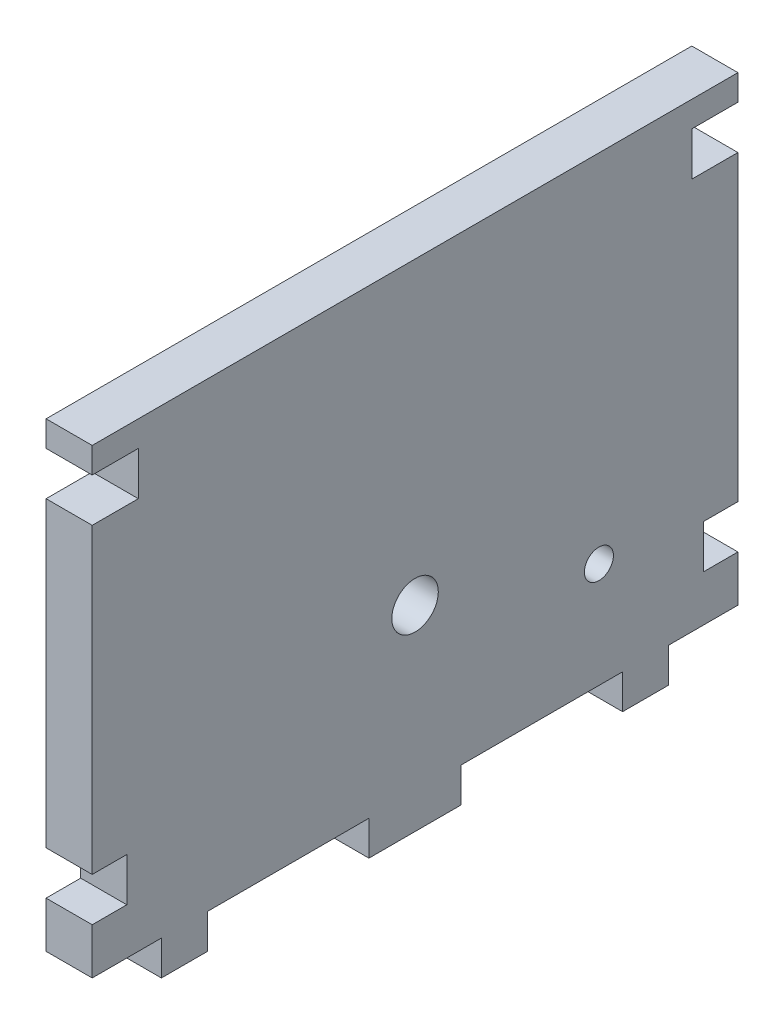
ISO-10303-21;
HEADER;
FILE_DESCRIPTION(('STEP AP214'),'2;1');
FILE_NAME('part.step','',(''),(''),'','','');
FILE_SCHEMA(('AUTOMOTIVE_DESIGN { 1 0 10303 214 1 1 1 1 }'));
ENDSEC;
DATA;
#1=APPLICATION_CONTEXT('core data for automotive mechanical design processes');
#2=APPLICATION_PROTOCOL_DEFINITION('international standard','automotive_design',2000,#1);
#3=PRODUCT_CONTEXT('',#1,'mechanical');
#4=PRODUCT('Part','Part','',(#3));
#5=PRODUCT_RELATED_PRODUCT_CATEGORY('part','',(#4));
#6=PRODUCT_DEFINITION_FORMATION('','',#4);
#7=PRODUCT_DEFINITION_CONTEXT('part definition',#1,'design');
#8=PRODUCT_DEFINITION('design','',#6,#7);
#9=PRODUCT_DEFINITION_SHAPE('','',#8);
#10=(LENGTH_UNIT() NAMED_UNIT(*) SI_UNIT(.MILLI.,.METRE.));
#11=(NAMED_UNIT(*) PLANE_ANGLE_UNIT() SI_UNIT($,.RADIAN.));
#12=(NAMED_UNIT(*) SI_UNIT($,.STERADIAN.) SOLID_ANGLE_UNIT());
#13=UNCERTAINTY_MEASURE_WITH_UNIT(LENGTH_MEASURE(1.E-05),#10,'distance_accuracy_value','');
#14=(GEOMETRIC_REPRESENTATION_CONTEXT(3) GLOBAL_UNCERTAINTY_ASSIGNED_CONTEXT((#13)) GLOBAL_UNIT_ASSIGNED_CONTEXT((#10,
#11,#12)) REPRESENTATION_CONTEXT('',''));
#15=CARTESIAN_POINT('',(0.,0.,0.));
#16=DIRECTION('',(0.,0.,1.));
#17=DIRECTION('',(1.,0.,0.));
#18=AXIS2_PLACEMENT_3D('',#15,#16,#17);
#19=CARTESIAN_POINT('',(6.35,0.,39.6875));
#20=DIRECTION('',(0.,0.,-1.));
#21=DIRECTION('',(-1.,0.,0.));
#22=AXIS2_PLACEMENT_3D('',#19,#20,#21);
#23=PLANE('',#22);
#24=DIRECTION('',(0.,-1.,0.));
#25=VECTOR('',#24,1.);
#26=CARTESIAN_POINT('',(0.,0.,39.6875));
#27=LINE('',#26,#25);
#28=CARTESIAN_POINT('',(0.,-9.88059999999999,39.6875));
#29=VERTEX_POINT('',#28);
#30=CARTESIAN_POINT('',(0.,-15.875,39.6875));
#31=VERTEX_POINT('',#30);
#32=EDGE_CURVE('E371',#29,#31,#27,.T.);
#33=ORIENTED_EDGE('',*,*,#32,.T.);
#34=DIRECTION('',(-1.,0.,0.));
#35=VECTOR('',#34,1.);
#36=CARTESIAN_POINT('',(6.35,-15.875,39.6875));
#37=LINE('',#36,#35);
#38=CARTESIAN_POINT('',(6.35,-15.875,39.6875));
#39=VERTEX_POINT('',#38);
#40=EDGE_CURVE('E11',#39,#31,#37,.T.);
#41=ORIENTED_EDGE('',*,*,#40,.F.);
#42=DIRECTION('',(0.,-1.,0.));
#43=VECTOR('',#42,1.);
#44=CARTESIAN_POINT('',(6.35,0.,39.6875));
#45=LINE('',#44,#43);
#46=CARTESIAN_POINT('',(6.35,-9.88059999999999,39.6875));
#47=VERTEX_POINT('',#46);
#48=EDGE_CURVE('E283',#47,#39,#45,.T.);
#49=ORIENTED_EDGE('',*,*,#48,.F.);
#50=DIRECTION('',(-1.,0.,0.));
#51=VECTOR('',#50,1.);
#52=CARTESIAN_POINT('',(6.35,-9.88059999999999,39.6875));
#53=LINE('',#52,#51);
#54=EDGE_CURVE('E271',#47,#29,#53,.T.);
#55=ORIENTED_EDGE('',*,*,#54,.T.);
#56=EDGE_LOOP('',(#33,#41,#49,#55));
#57=FACE_BOUND('',#56,.T.);
#58=ADVANCED_FACE('F35',(#57),#23,.F.);
#59=CARTESIAN_POINT('',(6.35,-15.8750000000001,0.));
#60=DIRECTION('',(0.,-1.,0.));
#61=DIRECTION('',(0.,0.,-1.));
#62=AXIS2_PLACEMENT_3D('',#59,#60,#61);
#63=PLANE('',#62);
#64=DIRECTION('',(0.,0.,1.));
#65=VECTOR('',#64,1.);
#66=CARTESIAN_POINT('',(0.,-15.8750000000001,0.));
#67=LINE('',#66,#65);
#68=CARTESIAN_POINT('',(0.,-15.875,44.45));
#69=VERTEX_POINT('',#68);
#70=EDGE_CURVE('E365',#31,#69,#67,.T.);
#71=ORIENTED_EDGE('',*,*,#70,.T.);
#72=DIRECTION('',(-1.,0.,0.));
#73=VECTOR('',#72,1.);
#74=CARTESIAN_POINT('',(6.35,-15.875,44.45));
#75=LINE('',#74,#73);
#76=CARTESIAN_POINT('',(6.35,-15.875,44.45));
#77=VERTEX_POINT('',#76);
#78=EDGE_CURVE('E44',#77,#69,#75,.T.);
#79=ORIENTED_EDGE('',*,*,#78,.F.);
#80=DIRECTION('',(0.,0.,1.));
#81=VECTOR('',#80,1.);
#82=CARTESIAN_POINT('',(6.35,-15.8750000000001,0.));
#83=LINE('',#82,#81);
#84=EDGE_CURVE('E163',#39,#77,#83,.T.);
#85=ORIENTED_EDGE('',*,*,#84,.F.);
#86=ORIENTED_EDGE('',*,*,#40,.T.);
#87=EDGE_LOOP('',(#71,#79,#85,#86));
#88=FACE_BOUND('',#87,.T.);
#89=ADVANCED_FACE('F366',(#88),#63,.F.);
#90=CARTESIAN_POINT('',(6.35,0.,44.45));
#91=DIRECTION('',(0.,0.,1.));
#92=DIRECTION('',(1.,0.,0.));
#93=AXIS2_PLACEMENT_3D('',#90,#91,#92);
#94=PLANE('',#93);
#95=DIRECTION('',(0.,1.,0.));
#96=VECTOR('',#95,1.);
#97=CARTESIAN_POINT('',(0.,0.,44.45));
#98=LINE('',#97,#96);
#99=CARTESIAN_POINT('',(0.,-22.225,44.45));
#100=VERTEX_POINT('',#99);
#101=EDGE_CURVE('E296',#100,#69,#98,.T.);
#102=ORIENTED_EDGE('',*,*,#101,.F.);
#103=DIRECTION('',(-1.,0.,0.));
#104=VECTOR('',#103,1.);
#105=CARTESIAN_POINT('',(6.35,-22.225,44.45));
#106=LINE('',#105,#104);
#107=CARTESIAN_POINT('',(6.35,-22.225,44.45));
#108=VERTEX_POINT('',#107);
#109=EDGE_CURVE('E359',#108,#100,#106,.T.);
#110=ORIENTED_EDGE('',*,*,#109,.F.);
#111=DIRECTION('',(0.,1.,0.));
#112=VECTOR('',#111,1.);
#113=CARTESIAN_POINT('',(6.35,0.,44.45));
#114=LINE('',#113,#112);
#115=EDGE_CURVE('E270',#108,#77,#114,.T.);
#116=ORIENTED_EDGE('',*,*,#115,.T.);
#117=ORIENTED_EDGE('',*,*,#78,.T.);
#118=EDGE_LOOP('',(#102,#110,#116,#117));
#119=FACE_BOUND('',#118,.T.);
#120=ADVANCED_FACE('F362',(#119),#94,.T.);
#121=CARTESIAN_POINT('',(6.35,-22.225,0.));
#122=DIRECTION('',(0.,-1.,0.));
#123=DIRECTION('',(0.,0.,-1.));
#124=AXIS2_PLACEMENT_3D('',#121,#122,#123);
#125=PLANE('',#124);
#126=DIRECTION('',(0.,0.,1.));
#127=VECTOR('',#126,1.);
#128=CARTESIAN_POINT('',(0.,-22.225,0.));
#129=LINE('',#128,#127);
#130=CARTESIAN_POINT('',(0.,-22.225,34.925));
#131=VERTEX_POINT('',#130);
#132=EDGE_CURVE('E376',#131,#100,#129,.T.);
#133=ORIENTED_EDGE('',*,*,#132,.F.);
#134=DIRECTION('',(-1.,0.,0.));
#135=VECTOR('',#134,1.);
#136=CARTESIAN_POINT('',(6.35,-22.225,34.925));
#137=LINE('',#136,#135);
#138=CARTESIAN_POINT('',(6.35,-22.225,34.925));
#139=VERTEX_POINT('',#138);
#140=EDGE_CURVE('E357',#139,#131,#137,.T.);
#141=ORIENTED_EDGE('',*,*,#140,.F.);
#142=DIRECTION('',(0.,0.,1.));
#143=VECTOR('',#142,1.);
#144=CARTESIAN_POINT('',(6.35,-22.225,0.));
#145=LINE('',#144,#143);
#146=EDGE_CURVE('E276',#139,#108,#145,.T.);
#147=ORIENTED_EDGE('',*,*,#146,.T.);
#148=ORIENTED_EDGE('',*,*,#109,.T.);
#149=EDGE_LOOP('',(#133,#141,#147,#148));
#150=FACE_BOUND('',#149,.T.);
#151=ADVANCED_FACE('F561',(#150),#125,.T.);
#152=CARTESIAN_POINT('',(6.35,0.,34.925));
#153=DIRECTION('',(0.,0.,1.));
#154=DIRECTION('',(0.,-1.,0.));
#155=AXIS2_PLACEMENT_3D('',#152,#153,#154);
#156=PLANE('',#155);
#157=DIRECTION('',(0.,1.,0.));
#158=VECTOR('',#157,1.);
#159=CARTESIAN_POINT('',(0.,0.,34.925));
#160=LINE('',#159,#158);
#161=CARTESIAN_POINT('',(0.,-26.9875,34.925));
#162=VERTEX_POINT('',#161);
#163=EDGE_CURVE('E377',#162,#131,#160,.T.);
#164=ORIENTED_EDGE('',*,*,#163,.F.);
#165=DIRECTION('',(-1.,0.,0.));
#166=VECTOR('',#165,1.);
#167=CARTESIAN_POINT('',(6.35,-26.9875,34.925));
#168=LINE('',#167,#166);
#169=CARTESIAN_POINT('',(6.35,-26.9875,34.925));
#170=VERTEX_POINT('',#169);
#171=EDGE_CURVE('E355',#170,#162,#168,.T.);
#172=ORIENTED_EDGE('',*,*,#171,.F.);
#173=DIRECTION('',(0.,1.,0.));
#174=VECTOR('',#173,1.);
#175=CARTESIAN_POINT('',(6.35,0.,34.925));
#176=LINE('',#175,#174);
#177=EDGE_CURVE('E280',#170,#139,#176,.T.);
#178=ORIENTED_EDGE('',*,*,#177,.T.);
#179=ORIENTED_EDGE('',*,*,#140,.T.);
#180=EDGE_LOOP('',(#164,#172,#178,#179));
#181=FACE_BOUND('',#180,.T.);
#182=ADVANCED_FACE('F504',(#181),#156,.T.);
#183=CARTESIAN_POINT('',(6.35,-26.9875,0.));
#184=DIRECTION('',(0.,-1.,0.));
#185=DIRECTION('',(0.,0.,-1.));
#186=AXIS2_PLACEMENT_3D('',#183,#184,#185);
#187=PLANE('',#186);
#188=DIRECTION('',(0.,0.,1.));
#189=VECTOR('',#188,1.);
#190=CARTESIAN_POINT('',(0.,-26.9875,0.));
#191=LINE('',#190,#189);
#192=CARTESIAN_POINT('',(0.,-26.9875,28.575));
#193=VERTEX_POINT('',#192);
#194=EDGE_CURVE('E384',#193,#162,#191,.T.);
#195=ORIENTED_EDGE('',*,*,#194,.F.);
#196=DIRECTION('',(-1.,0.,0.));
#197=VECTOR('',#196,1.);
#198=CARTESIAN_POINT('',(6.35,-26.9875,28.575));
#199=LINE('',#198,#197);
#200=CARTESIAN_POINT('',(6.35,-26.9875,28.575));
#201=VERTEX_POINT('',#200);
#202=EDGE_CURVE('E353',#201,#193,#199,.T.);
#203=ORIENTED_EDGE('',*,*,#202,.F.);
#204=DIRECTION('',(0.,0.,1.));
#205=VECTOR('',#204,1.);
#206=CARTESIAN_POINT('',(6.35,-26.9875,0.));
#207=LINE('',#206,#205);
#208=EDGE_CURVE('E497',#201,#170,#207,.T.);
#209=ORIENTED_EDGE('',*,*,#208,.T.);
#210=ORIENTED_EDGE('',*,*,#171,.T.);
#211=EDGE_LOOP('',(#195,#203,#209,#210));
#212=FACE_BOUND('',#211,.T.);
#213=ADVANCED_FACE('F509',(#212),#187,.T.);
#214=CARTESIAN_POINT('',(6.35,-2.70616862252385E-13,28.5750000000003));
#215=DIRECTION('',(0.,0.,1.));
#216=DIRECTION('',(0.,-1.,0.));
#217=AXIS2_PLACEMENT_3D('',#214,#215,#216);
#218=PLANE('',#217);
#219=DIRECTION('',(0.,1.,0.));
#220=VECTOR('',#219,1.);
#221=CARTESIAN_POINT('',(0.,-2.70616862252385E-13,28.5750000000003));
#222=LINE('',#221,#220);
#223=CARTESIAN_POINT('',(0.,-22.225,28.575));
#224=VERTEX_POINT('',#223);
#225=EDGE_CURVE('E387',#193,#224,#222,.T.);
#226=ORIENTED_EDGE('',*,*,#225,.T.);
#227=DIRECTION('',(-1.,0.,0.));
#228=VECTOR('',#227,1.);
#229=CARTESIAN_POINT('',(6.35,-22.225,28.575));
#230=LINE('',#229,#228);
#231=CARTESIAN_POINT('',(6.35,-22.225,28.575));
#232=VERTEX_POINT('',#231);
#233=EDGE_CURVE('E351',#232,#224,#230,.T.);
#234=ORIENTED_EDGE('',*,*,#233,.F.);
#235=DIRECTION('',(0.,1.,0.));
#236=VECTOR('',#235,1.);
#237=CARTESIAN_POINT('',(6.35,-2.70616862252385E-13,28.5750000000003));
#238=LINE('',#237,#236);
#239=EDGE_CURVE('E495',#201,#232,#238,.T.);
#240=ORIENTED_EDGE('',*,*,#239,.F.);
#241=ORIENTED_EDGE('',*,*,#202,.T.);
#242=EDGE_LOOP('',(#226,#234,#240,#241));
#243=FACE_BOUND('',#242,.T.);
#244=ADVANCED_FACE('F514',(#243),#218,.F.);
#245=CARTESIAN_POINT('',(0.,-22.225,6.34999999999999));
#246=VERTEX_POINT('',#245);
#247=EDGE_CURVE('E380',#246,#224,#129,.T.);
#248=ORIENTED_EDGE('',*,*,#247,.F.);
#249=DIRECTION('',(-1.,0.,0.));
#250=VECTOR('',#249,1.);
#251=CARTESIAN_POINT('',(6.35,-22.225,6.34999999999999));
#252=LINE('',#251,#250);
#253=CARTESIAN_POINT('',(6.35,-22.225,6.34999999999999));
#254=VERTEX_POINT('',#253);
#255=EDGE_CURVE('E349',#254,#246,#252,.T.);
#256=ORIENTED_EDGE('',*,*,#255,.F.);
#257=EDGE_CURVE('E282',#254,#232,#145,.T.);
#258=ORIENTED_EDGE('',*,*,#257,.T.);
#259=ORIENTED_EDGE('',*,*,#233,.T.);
#260=EDGE_LOOP('',(#248,#256,#258,#259));
#261=FACE_BOUND('',#260,.T.);
#262=ADVANCED_FACE('F558',(#261),#125,.T.);
#263=CARTESIAN_POINT('',(6.35,0.,6.34999999999999));
#264=DIRECTION('',(0.,0.,1.));
#265=DIRECTION('',(1.,0.,0.));
#266=AXIS2_PLACEMENT_3D('',#263,#264,#265);
#267=PLANE('',#266);
#268=DIRECTION('',(0.,1.,0.));
#269=VECTOR('',#268,1.);
#270=CARTESIAN_POINT('',(0.,0.,6.34999999999999));
#271=LINE('',#270,#269);
#272=CARTESIAN_POINT('',(0.,-26.9875,6.34999999999999));
#273=VERTEX_POINT('',#272);
#274=EDGE_CURVE('E390',#273,#246,#271,.T.);
#275=ORIENTED_EDGE('',*,*,#274,.F.);
#276=DIRECTION('',(-1.,0.,0.));
#277=VECTOR('',#276,1.);
#278=CARTESIAN_POINT('',(6.35,-26.9875,6.34999999999999));
#279=LINE('',#278,#277);
#280=CARTESIAN_POINT('',(6.35,-26.9875,6.34999999999999));
#281=VERTEX_POINT('',#280);
#282=EDGE_CURVE('E347',#281,#273,#279,.T.);
#283=ORIENTED_EDGE('',*,*,#282,.F.);
#284=DIRECTION('',(0.,1.,0.));
#285=VECTOR('',#284,1.);
#286=CARTESIAN_POINT('',(6.35,0.,6.34999999999999));
#287=LINE('',#286,#285);
#288=EDGE_CURVE('E492',#281,#254,#287,.T.);
#289=ORIENTED_EDGE('',*,*,#288,.T.);
#290=ORIENTED_EDGE('',*,*,#255,.T.);
#291=EDGE_LOOP('',(#275,#283,#289,#290));
#292=FACE_BOUND('',#291,.T.);
#293=ADVANCED_FACE('F522',(#292),#267,.T.);
#294=CARTESIAN_POINT('',(6.35,-26.9875,0.));
#295=DIRECTION('',(0.,-1.,0.));
#296=DIRECTION('',(0.,0.,-1.));
#297=AXIS2_PLACEMENT_3D('',#294,#295,#296);
#298=PLANE('',#297);
#299=DIRECTION('',(0.,0.,1.));
#300=VECTOR('',#299,1.);
#301=CARTESIAN_POINT('',(0.,-26.9875,0.));
#302=LINE('',#301,#300);
#303=CARTESIAN_POINT('',(0.,-26.9875,-6.35000000000001));
#304=VERTEX_POINT('',#303);
#305=EDGE_CURVE('E393',#304,#273,#302,.T.);
#306=ORIENTED_EDGE('',*,*,#305,.F.);
#307=DIRECTION('',(-1.,0.,0.));
#308=VECTOR('',#307,1.);
#309=CARTESIAN_POINT('',(6.35,-26.9875,-6.35000000000001));
#310=LINE('',#309,#308);
#311=CARTESIAN_POINT('',(6.35,-26.9875,-6.35000000000001));
#312=VERTEX_POINT('',#311);
#313=EDGE_CURVE('E345',#312,#304,#310,.T.);
#314=ORIENTED_EDGE('',*,*,#313,.F.);
#315=DIRECTION('',(0.,0.,1.));
#316=VECTOR('',#315,1.);
#317=CARTESIAN_POINT('',(6.35,-26.9875,0.));
#318=LINE('',#317,#316);
#319=EDGE_CURVE('E489',#312,#281,#318,.T.);
#320=ORIENTED_EDGE('',*,*,#319,.T.);
#321=ORIENTED_EDGE('',*,*,#282,.T.);
#322=EDGE_LOOP('',(#306,#314,#320,#321));
#323=FACE_BOUND('',#322,.T.);
#324=ADVANCED_FACE('F526',(#323),#298,.T.);
#325=CARTESIAN_POINT('',(6.35,0.,-6.35000000000001));
#326=DIRECTION('',(0.,0.,1.));
#327=DIRECTION('',(1.,0.,0.));
#328=AXIS2_PLACEMENT_3D('',#325,#326,#327);
#329=PLANE('',#328);
#330=DIRECTION('',(0.,1.,0.));
#331=VECTOR('',#330,1.);
#332=CARTESIAN_POINT('',(0.,0.,-6.35000000000001));
#333=LINE('',#332,#331);
#334=CARTESIAN_POINT('',(0.,-22.225,-6.35000000000001));
#335=VERTEX_POINT('',#334);
#336=EDGE_CURVE('E396',#304,#335,#333,.T.);
#337=ORIENTED_EDGE('',*,*,#336,.T.);
#338=DIRECTION('',(-1.,0.,0.));
#339=VECTOR('',#338,1.);
#340=CARTESIAN_POINT('',(6.35,-22.225,-6.35000000000001));
#341=LINE('',#340,#339);
#342=CARTESIAN_POINT('',(6.35,-22.225,-6.35000000000001));
#343=VERTEX_POINT('',#342);
#344=EDGE_CURVE('E343',#343,#335,#341,.T.);
#345=ORIENTED_EDGE('',*,*,#344,.F.);
#346=DIRECTION('',(0.,1.,0.));
#347=VECTOR('',#346,1.);
#348=CARTESIAN_POINT('',(6.35,0.,-6.35000000000001));
#349=LINE('',#348,#347);
#350=EDGE_CURVE('E487',#312,#343,#349,.T.);
#351=ORIENTED_EDGE('',*,*,#350,.F.);
#352=ORIENTED_EDGE('',*,*,#313,.T.);
#353=EDGE_LOOP('',(#337,#345,#351,#352));
#354=FACE_BOUND('',#353,.T.);
#355=ADVANCED_FACE('F533',(#354),#329,.F.);
#356=CARTESIAN_POINT('',(0.,-22.225,-28.5749999999999));
#357=VERTEX_POINT('',#356);
#358=EDGE_CURVE('E399',#357,#335,#129,.T.);
#359=ORIENTED_EDGE('',*,*,#358,.F.);
#360=DIRECTION('',(-1.,0.,0.));
#361=VECTOR('',#360,1.);
#362=CARTESIAN_POINT('',(6.35,-22.225,-28.5749999999999));
#363=LINE('',#362,#361);
#364=CARTESIAN_POINT('',(6.35,-22.225,-28.5749999999999));
#365=VERTEX_POINT('',#364);
#366=EDGE_CURVE('E341',#365,#357,#363,.T.);
#367=ORIENTED_EDGE('',*,*,#366,.F.);
#368=EDGE_CURVE('E486',#365,#343,#145,.T.);
#369=ORIENTED_EDGE('',*,*,#368,.T.);
#370=ORIENTED_EDGE('',*,*,#344,.T.);
#371=EDGE_LOOP('',(#359,#367,#369,#370));
#372=FACE_BOUND('',#371,.T.);
#373=ADVANCED_FACE('F538',(#372),#125,.T.);
#374=CARTESIAN_POINT('',(6.35,3.12250225675822E-13,-28.5749999999997));
#375=DIRECTION('',(0.,0.,1.));
#376=DIRECTION('',(0.,-1.,0.));
#377=AXIS2_PLACEMENT_3D('',#374,#375,#376);
#378=PLANE('',#377);
#379=DIRECTION('',(0.,1.,0.));
#380=VECTOR('',#379,1.);
#381=CARTESIAN_POINT('',(0.,3.12250225675822E-13,-28.5749999999997));
#382=LINE('',#381,#380);
#383=CARTESIAN_POINT('',(0.,-26.9875,-28.575));
#384=VERTEX_POINT('',#383);
#385=EDGE_CURVE('E400',#384,#357,#382,.T.);
#386=ORIENTED_EDGE('',*,*,#385,.F.);
#387=DIRECTION('',(-1.,0.,0.));
#388=VECTOR('',#387,1.);
#389=CARTESIAN_POINT('',(6.35,-26.9875,-28.575));
#390=LINE('',#389,#388);
#391=CARTESIAN_POINT('',(6.35,-26.9875,-28.575));
#392=VERTEX_POINT('',#391);
#393=EDGE_CURVE('E339',#392,#384,#390,.T.);
#394=ORIENTED_EDGE('',*,*,#393,.F.);
#395=DIRECTION('',(0.,1.,0.));
#396=VECTOR('',#395,1.);
#397=CARTESIAN_POINT('',(6.35,3.12250225675822E-13,-28.5749999999997));
#398=LINE('',#397,#396);
#399=EDGE_CURVE('E483',#392,#365,#398,.T.);
#400=ORIENTED_EDGE('',*,*,#399,.T.);
#401=ORIENTED_EDGE('',*,*,#366,.T.);
#402=EDGE_LOOP('',(#386,#394,#400,#401));
#403=FACE_BOUND('',#402,.T.);
#404=ADVANCED_FACE('F571',(#403),#378,.T.);
#405=CARTESIAN_POINT('',(6.35,-26.9874999999999,0.));
#406=DIRECTION('',(0.,1.,0.));
#407=DIRECTION('',(0.,0.,1.));
#408=AXIS2_PLACEMENT_3D('',#405,#406,#407);
#409=PLANE('',#408);
#410=DIRECTION('',(0.,0.,-1.));
#411=VECTOR('',#410,1.);
#412=CARTESIAN_POINT('',(0.,-26.9874999999999,0.));
#413=LINE('',#412,#411);
#414=CARTESIAN_POINT('',(0.,-26.9875,-34.925));
#415=VERTEX_POINT('',#414);
#416=EDGE_CURVE('E403',#384,#415,#413,.T.);
#417=ORIENTED_EDGE('',*,*,#416,.T.);
#418=DIRECTION('',(-1.,0.,0.));
#419=VECTOR('',#418,1.);
#420=CARTESIAN_POINT('',(6.35,-26.9875,-34.925));
#421=LINE('',#420,#419);
#422=CARTESIAN_POINT('',(6.35,-26.9875,-34.925));
#423=VERTEX_POINT('',#422);
#424=EDGE_CURVE('E336',#423,#415,#421,.T.);
#425=ORIENTED_EDGE('',*,*,#424,.F.);
#426=DIRECTION('',(0.,0.,-1.));
#427=VECTOR('',#426,1.);
#428=CARTESIAN_POINT('',(6.35,-26.9874999999999,0.));
#429=LINE('',#428,#427);
#430=EDGE_CURVE('E481',#392,#423,#429,.T.);
#431=ORIENTED_EDGE('',*,*,#430,.F.);
#432=ORIENTED_EDGE('',*,*,#393,.T.);
#433=EDGE_LOOP('',(#417,#425,#431,#432));
#434=FACE_BOUND('',#433,.T.);
#435=ADVANCED_FACE('F689',(#434),#409,.F.);
#436=CARTESIAN_POINT('',(6.35,0.,-34.925));
#437=DIRECTION('',(0.,0.,1.));
#438=DIRECTION('',(0.,-1.,0.));
#439=AXIS2_PLACEMENT_3D('',#436,#437,#438);
#440=PLANE('',#439);
#441=DIRECTION('',(0.,1.,0.));
#442=VECTOR('',#441,1.);
#443=CARTESIAN_POINT('',(0.,0.,-34.925));
#444=LINE('',#443,#442);
#445=CARTESIAN_POINT('',(0.,-22.225,-34.925));
#446=VERTEX_POINT('',#445);
#447=EDGE_CURVE('E405',#415,#446,#444,.T.);
#448=ORIENTED_EDGE('',*,*,#447,.T.);
#449=DIRECTION('',(-1.,0.,0.));
#450=VECTOR('',#449,1.);
#451=CARTESIAN_POINT('',(6.35,-22.225,-34.925));
#452=LINE('',#451,#450);
#453=CARTESIAN_POINT('',(6.35,-22.225,-34.925));
#454=VERTEX_POINT('',#453);
#455=EDGE_CURVE('E334',#454,#446,#452,.T.);
#456=ORIENTED_EDGE('',*,*,#455,.F.);
#457=DIRECTION('',(0.,1.,0.));
#458=VECTOR('',#457,1.);
#459=CARTESIAN_POINT('',(6.35,0.,-34.925));
#460=LINE('',#459,#458);
#461=EDGE_CURVE('E479',#423,#454,#460,.T.);
#462=ORIENTED_EDGE('',*,*,#461,.F.);
#463=ORIENTED_EDGE('',*,*,#424,.T.);
#464=EDGE_LOOP('',(#448,#456,#462,#463));
#465=FACE_BOUND('',#464,.T.);
#466=ADVANCED_FACE('F552',(#465),#440,.F.);
#467=CARTESIAN_POINT('',(0.,-22.225,-44.45));
#468=VERTEX_POINT('',#467);
#469=EDGE_CURVE('E379',#468,#446,#129,.T.);
#470=ORIENTED_EDGE('',*,*,#469,.F.);
#471=DIRECTION('',(-1.,0.,0.));
#472=VECTOR('',#471,1.);
#473=CARTESIAN_POINT('',(6.35,-22.225,-44.45));
#474=LINE('',#473,#472);
#475=CARTESIAN_POINT('',(6.35,-22.225,-44.45));
#476=VERTEX_POINT('',#475);
#477=EDGE_CURVE('E332',#476,#468,#474,.T.);
#478=ORIENTED_EDGE('',*,*,#477,.F.);
#479=EDGE_CURVE('E281',#476,#454,#145,.T.);
#480=ORIENTED_EDGE('',*,*,#479,.T.);
#481=ORIENTED_EDGE('',*,*,#455,.T.);
#482=EDGE_LOOP('',(#470,#478,#480,#481));
#483=FACE_BOUND('',#482,.T.);
#484=ADVANCED_FACE('F543',(#483),#125,.T.);
#485=CARTESIAN_POINT('',(6.35,0.,-44.45));
#486=DIRECTION('',(0.,0.,1.));
#487=DIRECTION('',(1.,0.,0.));
#488=AXIS2_PLACEMENT_3D('',#485,#486,#487);
#489=PLANE('',#488);
#490=DIRECTION('',(0.,1.,0.));
#491=VECTOR('',#490,1.);
#492=CARTESIAN_POINT('',(0.,0.,-44.45));
#493=LINE('',#492,#491);
#494=CARTESIAN_POINT('',(0.,-15.875,-44.45));
#495=VERTEX_POINT('',#494);
#496=EDGE_CURVE('E408',#468,#495,#493,.T.);
#497=ORIENTED_EDGE('',*,*,#496,.T.);
#498=DIRECTION('',(-1.,0.,0.));
#499=VECTOR('',#498,1.);
#500=CARTESIAN_POINT('',(6.35,-15.875,-44.45));
#501=LINE('',#500,#499);
#502=CARTESIAN_POINT('',(6.35,-15.875,-44.45));
#503=VERTEX_POINT('',#502);
#504=EDGE_CURVE('E330',#503,#495,#501,.T.);
#505=ORIENTED_EDGE('',*,*,#504,.F.);
#506=DIRECTION('',(0.,1.,0.));
#507=VECTOR('',#506,1.);
#508=CARTESIAN_POINT('',(6.35,0.,-44.45));
#509=LINE('',#508,#507);
#510=EDGE_CURVE('E477',#476,#503,#509,.T.);
#511=ORIENTED_EDGE('',*,*,#510,.F.);
#512=ORIENTED_EDGE('',*,*,#477,.T.);
#513=EDGE_LOOP('',(#497,#505,#511,#512));
#514=FACE_BOUND('',#513,.T.);
#515=ADVANCED_FACE('F643',(#514),#489,.F.);
#516=CARTESIAN_POINT('',(6.35,-15.8750000000001,0.));
#517=DIRECTION('',(0.,1.,0.));
#518=DIRECTION('',(0.,0.,1.));
#519=AXIS2_PLACEMENT_3D('',#516,#517,#518);
#520=PLANE('',#519);
#521=DIRECTION('',(0.,0.,-1.));
#522=VECTOR('',#521,1.);
#523=CARTESIAN_POINT('',(0.,-15.8750000000001,0.));
#524=LINE('',#523,#522);
#525=CARTESIAN_POINT('',(0.,-15.875,-39.6875));
#526=VERTEX_POINT('',#525);
#527=EDGE_CURVE('E411',#526,#495,#524,.T.);
#528=ORIENTED_EDGE('',*,*,#527,.F.);
#529=DIRECTION('',(-1.,0.,0.));
#530=VECTOR('',#529,1.);
#531=CARTESIAN_POINT('',(6.35,-15.875,-39.6875));
#532=LINE('',#531,#530);
#533=CARTESIAN_POINT('',(6.35,-15.875,-39.6875));
#534=VERTEX_POINT('',#533);
#535=EDGE_CURVE('E328',#534,#526,#532,.T.);
#536=ORIENTED_EDGE('',*,*,#535,.F.);
#537=DIRECTION('',(0.,0.,-1.));
#538=VECTOR('',#537,1.);
#539=CARTESIAN_POINT('',(6.35,-15.8750000000001,0.));
#540=LINE('',#539,#538);
#541=EDGE_CURVE('E474',#534,#503,#540,.T.);
#542=ORIENTED_EDGE('',*,*,#541,.T.);
#543=ORIENTED_EDGE('',*,*,#504,.T.);
#544=EDGE_LOOP('',(#528,#536,#542,#543));
#545=FACE_BOUND('',#544,.T.);
#546=ADVANCED_FACE('F649',(#545),#520,.T.);
#547=CARTESIAN_POINT('',(6.35,0.,-39.6875));
#548=DIRECTION('',(0.,0.,1.));
#549=DIRECTION('',(1.,0.,0.));
#550=AXIS2_PLACEMENT_3D('',#547,#548,#549);
#551=PLANE('',#550);
#552=DIRECTION('',(0.,1.,0.));
#553=VECTOR('',#552,1.);
#554=CARTESIAN_POINT('',(0.,0.,-39.6875));
#555=LINE('',#554,#553);
#556=CARTESIAN_POINT('',(0.,-9.88059999999999,-39.6875));
#557=VERTEX_POINT('',#556);
#558=EDGE_CURVE('E415',#526,#557,#555,.T.);
#559=ORIENTED_EDGE('',*,*,#558,.T.);
#560=DIRECTION('',(-1.,0.,0.));
#561=VECTOR('',#560,1.);
#562=CARTESIAN_POINT('',(6.35,-9.88059999999999,-39.6875));
#563=LINE('',#562,#561);
#564=CARTESIAN_POINT('',(6.35,-9.88059999999999,-39.6875));
#565=VERTEX_POINT('',#564);
#566=EDGE_CURVE('E325',#565,#557,#563,.T.);
#567=ORIENTED_EDGE('',*,*,#566,.F.);
#568=DIRECTION('',(0.,1.,0.));
#569=VECTOR('',#568,1.);
#570=CARTESIAN_POINT('',(6.35,0.,-39.6875));
#571=LINE('',#570,#569);
#572=EDGE_CURVE('E472',#534,#565,#571,.T.);
#573=ORIENTED_EDGE('',*,*,#572,.F.);
#574=ORIENTED_EDGE('',*,*,#535,.T.);
#575=EDGE_LOOP('',(#559,#567,#573,#574));
#576=FACE_BOUND('',#575,.T.);
#577=ADVANCED_FACE('F646',(#576),#551,.F.);
#578=CARTESIAN_POINT('',(6.35,-9.88059999999999,0.));
#579=DIRECTION('',(0.,1.,0.));
#580=DIRECTION('',(0.,0.,1.));
#581=AXIS2_PLACEMENT_3D('',#578,#579,#580);
#582=PLANE('',#581);
#583=DIRECTION('',(0.,0.,-1.));
#584=VECTOR('',#583,1.);
#585=CARTESIAN_POINT('',(0.,-9.88059999999999,0.));
#586=LINE('',#585,#584);
#587=CARTESIAN_POINT('',(0.,-9.88059999999999,-44.45));
#588=VERTEX_POINT('',#587);
#589=EDGE_CURVE('E417',#557,#588,#586,.T.);
#590=ORIENTED_EDGE('',*,*,#589,.T.);
#591=DIRECTION('',(-1.,0.,0.));
#592=VECTOR('',#591,1.);
#593=CARTESIAN_POINT('',(6.35,-9.88059999999999,-44.45));
#594=LINE('',#593,#592);
#595=CARTESIAN_POINT('',(6.35,-9.88059999999999,-44.45));
#596=VERTEX_POINT('',#595);
#597=EDGE_CURVE('E322',#596,#588,#594,.T.);
#598=ORIENTED_EDGE('',*,*,#597,.F.);
#599=DIRECTION('',(0.,0.,-1.));
#600=VECTOR('',#599,1.);
#601=CARTESIAN_POINT('',(6.35,-9.88059999999999,0.));
#602=LINE('',#601,#600);
#603=EDGE_CURVE('E470',#565,#596,#602,.T.);
#604=ORIENTED_EDGE('',*,*,#603,.F.);
#605=ORIENTED_EDGE('',*,*,#566,.T.);
#606=EDGE_LOOP('',(#590,#598,#604,#605));
#607=FACE_BOUND('',#606,.T.);
#608=ADVANCED_FACE('F641',(#607),#582,.F.);
#609=CARTESIAN_POINT('',(0.,31.75,-44.45));
#610=VERTEX_POINT('',#609);
#611=EDGE_CURVE('E412',#588,#610,#493,.T.);
#612=ORIENTED_EDGE('',*,*,#611,.T.);
#613=DIRECTION('',(-1.,0.,0.));
#614=VECTOR('',#613,1.);
#615=CARTESIAN_POINT('',(6.35,31.75,-44.45));
#616=LINE('',#615,#614);
#617=CARTESIAN_POINT('',(6.35,31.75,-44.45));
#618=VERTEX_POINT('',#617);
#619=EDGE_CURVE('E319',#618,#610,#616,.T.);
#620=ORIENTED_EDGE('',*,*,#619,.F.);
#621=EDGE_CURVE('E469',#596,#618,#509,.T.);
#622=ORIENTED_EDGE('',*,*,#621,.F.);
#623=ORIENTED_EDGE('',*,*,#597,.T.);
#624=EDGE_LOOP('',(#612,#620,#622,#623));
#625=FACE_BOUND('',#624,.T.);
#626=ADVANCED_FACE('F637',(#625),#489,.F.);
#627=CARTESIAN_POINT('',(6.35,31.7499999999999,0.));
#628=DIRECTION('',(0.,-1.,0.));
#629=DIRECTION('',(0.,0.,-1.));
#630=AXIS2_PLACEMENT_3D('',#627,#628,#629);
#631=PLANE('',#630);
#632=DIRECTION('',(0.,0.,1.));
#633=VECTOR('',#632,1.);
#634=CARTESIAN_POINT('',(0.,31.7499999999999,0.));
#635=LINE('',#634,#633);
#636=CARTESIAN_POINT('',(0.,31.75,-38.1));
#637=VERTEX_POINT('',#636);
#638=EDGE_CURVE('E419',#610,#637,#635,.T.);
#639=ORIENTED_EDGE('',*,*,#638,.T.);
#640=DIRECTION('',(-1.,0.,0.));
#641=VECTOR('',#640,1.);
#642=CARTESIAN_POINT('',(6.35,31.75,-38.1));
#643=LINE('',#642,#641);
#644=CARTESIAN_POINT('',(6.35,31.75,-38.1));
#645=VERTEX_POINT('',#644);
#646=EDGE_CURVE('E317',#645,#637,#643,.T.);
#647=ORIENTED_EDGE('',*,*,#646,.F.);
#648=DIRECTION('',(0.,0.,1.));
#649=VECTOR('',#648,1.);
#650=CARTESIAN_POINT('',(6.35,31.7499999999999,0.));
#651=LINE('',#650,#649);
#652=EDGE_CURVE('E467',#618,#645,#651,.T.);
#653=ORIENTED_EDGE('',*,*,#652,.F.);
#654=ORIENTED_EDGE('',*,*,#619,.T.);
#655=EDGE_LOOP('',(#639,#647,#653,#654));
#656=FACE_BOUND('',#655,.T.);
#657=ADVANCED_FACE('F633',(#656),#631,.F.);
#658=CARTESIAN_POINT('',(6.35,0.,-38.1));
#659=DIRECTION('',(0.,0.,-1.));
#660=DIRECTION('',(-1.,0.,0.));
#661=AXIS2_PLACEMENT_3D('',#658,#659,#660);
#662=PLANE('',#661);
#663=DIRECTION('',(0.,-1.,0.));
#664=VECTOR('',#663,1.);
#665=CARTESIAN_POINT('',(0.,0.,-38.1));
#666=LINE('',#665,#664);
#667=CARTESIAN_POINT('',(0.,37.7444,-38.1));
#668=VERTEX_POINT('',#667);
#669=EDGE_CURVE('E422',#668,#637,#666,.T.);
#670=ORIENTED_EDGE('',*,*,#669,.F.);
#671=DIRECTION('',(-1.,0.,0.));
#672=VECTOR('',#671,1.);
#673=CARTESIAN_POINT('',(6.35,37.7444,-38.1));
#674=LINE('',#673,#672);
#675=CARTESIAN_POINT('',(6.35,37.7444,-38.1));
#676=VERTEX_POINT('',#675);
#677=EDGE_CURVE('E315',#676,#668,#674,.T.);
#678=ORIENTED_EDGE('',*,*,#677,.F.);
#679=DIRECTION('',(0.,-1.,0.));
#680=VECTOR('',#679,1.);
#681=CARTESIAN_POINT('',(6.35,0.,-38.1));
#682=LINE('',#681,#680);
#683=EDGE_CURVE('E464',#676,#645,#682,.T.);
#684=ORIENTED_EDGE('',*,*,#683,.T.);
#685=ORIENTED_EDGE('',*,*,#646,.T.);
#686=EDGE_LOOP('',(#670,#678,#684,#685));
#687=FACE_BOUND('',#686,.T.);
#688=ADVANCED_FACE('F629',(#687),#662,.T.);
#689=CARTESIAN_POINT('',(6.35,37.7444,0.));
#690=DIRECTION('',(0.,-1.,0.));
#691=DIRECTION('',(0.,0.,-1.));
#692=AXIS2_PLACEMENT_3D('',#689,#690,#691);
#693=PLANE('',#692);
#694=DIRECTION('',(0.,0.,1.));
#695=VECTOR('',#694,1.);
#696=CARTESIAN_POINT('',(0.,37.7444,0.));
#697=LINE('',#696,#695);
#698=CARTESIAN_POINT('',(0.,37.7444,-44.45));
#699=VERTEX_POINT('',#698);
#700=EDGE_CURVE('E425',#699,#668,#697,.T.);
#701=ORIENTED_EDGE('',*,*,#700,.F.);
#702=DIRECTION('',(-1.,0.,0.));
#703=VECTOR('',#702,1.);
#704=CARTESIAN_POINT('',(6.35,37.7444,-44.45));
#705=LINE('',#704,#703);
#706=CARTESIAN_POINT('',(6.35,37.7444,-44.45));
#707=VERTEX_POINT('',#706);
#708=EDGE_CURVE('E313',#707,#699,#705,.T.);
#709=ORIENTED_EDGE('',*,*,#708,.F.);
#710=DIRECTION('',(0.,0.,1.));
#711=VECTOR('',#710,1.);
#712=CARTESIAN_POINT('',(6.35,37.7444,0.));
#713=LINE('',#712,#711);
#714=EDGE_CURVE('E461',#707,#676,#713,.T.);
#715=ORIENTED_EDGE('',*,*,#714,.T.);
#716=ORIENTED_EDGE('',*,*,#677,.T.);
#717=EDGE_LOOP('',(#701,#709,#715,#716));
#718=FACE_BOUND('',#717,.T.);
#719=ADVANCED_FACE('F625',(#718),#693,.T.);
#720=CARTESIAN_POINT('',(6.35,0.,-44.45));
#721=DIRECTION('',(0.,0.,-1.));
#722=DIRECTION('',(0.,1.,0.));
#723=AXIS2_PLACEMENT_3D('',#720,#721,#722);
#724=PLANE('',#723);
#725=DIRECTION('',(0.,-1.,0.));
#726=VECTOR('',#725,1.);
#727=CARTESIAN_POINT('',(0.,0.,-44.45));
#728=LINE('',#727,#726);
#729=CARTESIAN_POINT('',(0.,41.275,-44.45));
#730=VERTEX_POINT('',#729);
#731=EDGE_CURVE('E428',#730,#699,#728,.T.);
#732=ORIENTED_EDGE('',*,*,#731,.F.);
#733=DIRECTION('',(-1.,0.,0.));
#734=VECTOR('',#733,1.);
#735=CARTESIAN_POINT('',(6.35,41.275,-44.45));
#736=LINE('',#735,#734);
#737=CARTESIAN_POINT('',(6.35,41.275,-44.45));
#738=VERTEX_POINT('',#737);
#739=EDGE_CURVE('E311',#738,#730,#736,.T.);
#740=ORIENTED_EDGE('',*,*,#739,.F.);
#741=DIRECTION('',(0.,-1.,0.));
#742=VECTOR('',#741,1.);
#743=CARTESIAN_POINT('',(6.35,0.,-44.45));
#744=LINE('',#743,#742);
#745=EDGE_CURVE('E458',#738,#707,#744,.T.);
#746=ORIENTED_EDGE('',*,*,#745,.T.);
#747=ORIENTED_EDGE('',*,*,#708,.T.);
#748=EDGE_LOOP('',(#732,#740,#746,#747));
#749=FACE_BOUND('',#748,.T.);
#750=ADVANCED_FACE('F621',(#749),#724,.T.);
#751=CARTESIAN_POINT('',(6.35,41.275,0.));
#752=DIRECTION('',(0.,1.,0.));
#753=DIRECTION('',(0.,0.,1.));
#754=AXIS2_PLACEMENT_3D('',#751,#752,#753);
#755=PLANE('',#754);
#756=DIRECTION('',(0.,0.,-1.));
#757=VECTOR('',#756,1.);
#758=CARTESIAN_POINT('',(0.,41.275,0.));
#759=LINE('',#758,#757);
#760=CARTESIAN_POINT('',(0.,41.275,44.45));
#761=VERTEX_POINT('',#760);
#762=EDGE_CURVE('E431',#761,#730,#759,.T.);
#763=ORIENTED_EDGE('',*,*,#762,.F.);
#764=DIRECTION('',(-1.,0.,0.));
#765=VECTOR('',#764,1.);
#766=CARTESIAN_POINT('',(6.35,41.275,44.45));
#767=LINE('',#766,#765);
#768=CARTESIAN_POINT('',(6.35,41.275,44.45));
#769=VERTEX_POINT('',#768);
#770=EDGE_CURVE('E309',#769,#761,#767,.T.);
#771=ORIENTED_EDGE('',*,*,#770,.F.);
#772=DIRECTION('',(0.,0.,-1.));
#773=VECTOR('',#772,1.);
#774=CARTESIAN_POINT('',(6.35,41.275,0.));
#775=LINE('',#774,#773);
#776=EDGE_CURVE('E455',#769,#738,#775,.T.);
#777=ORIENTED_EDGE('',*,*,#776,.T.);
#778=ORIENTED_EDGE('',*,*,#739,.T.);
#779=EDGE_LOOP('',(#763,#771,#777,#778));
#780=FACE_BOUND('',#779,.T.);
#781=ADVANCED_FACE('F617',(#780),#755,.T.);
#782=CARTESIAN_POINT('',(6.35,0.,44.45));
#783=DIRECTION('',(0.,0.,-1.));
#784=DIRECTION('',(-1.,0.,0.));
#785=AXIS2_PLACEMENT_3D('',#782,#783,#784);
#786=PLANE('',#785);
#787=DIRECTION('',(0.,-1.,0.));
#788=VECTOR('',#787,1.);
#789=CARTESIAN_POINT('',(0.,0.,44.45));
#790=LINE('',#789,#788);
#791=CARTESIAN_POINT('',(0.,37.7444,44.45));
#792=VERTEX_POINT('',#791);
#793=EDGE_CURVE('E434',#761,#792,#790,.T.);
#794=ORIENTED_EDGE('',*,*,#793,.T.);
#795=DIRECTION('',(-1.,0.,0.));
#796=VECTOR('',#795,1.);
#797=CARTESIAN_POINT('',(6.35,37.7444,44.45));
#798=LINE('',#797,#796);
#799=CARTESIAN_POINT('',(6.35,37.7444,44.45));
#800=VERTEX_POINT('',#799);
#801=EDGE_CURVE('E306',#800,#792,#798,.T.);
#802=ORIENTED_EDGE('',*,*,#801,.F.);
#803=DIRECTION('',(0.,-1.,0.));
#804=VECTOR('',#803,1.);
#805=CARTESIAN_POINT('',(6.35,0.,44.45));
#806=LINE('',#805,#804);
#807=EDGE_CURVE('E453',#769,#800,#806,.T.);
#808=ORIENTED_EDGE('',*,*,#807,.F.);
#809=ORIENTED_EDGE('',*,*,#770,.T.);
#810=EDGE_LOOP('',(#794,#802,#808,#809));
#811=FACE_BOUND('',#810,.T.);
#812=ADVANCED_FACE('F613',(#811),#786,.F.);
#813=CARTESIAN_POINT('',(6.35,37.7444,0.));
#814=DIRECTION('',(0.,1.,0.));
#815=DIRECTION('',(0.,0.,1.));
#816=AXIS2_PLACEMENT_3D('',#813,#814,#815);
#817=PLANE('',#816);
#818=DIRECTION('',(0.,0.,-1.));
#819=VECTOR('',#818,1.);
#820=CARTESIAN_POINT('',(0.,37.7444,0.));
#821=LINE('',#820,#819);
#822=CARTESIAN_POINT('',(0.,37.7444,38.1));
#823=VERTEX_POINT('',#822);
#824=EDGE_CURVE('E436',#792,#823,#821,.T.);
#825=ORIENTED_EDGE('',*,*,#824,.T.);
#826=DIRECTION('',(-1.,0.,0.));
#827=VECTOR('',#826,1.);
#828=CARTESIAN_POINT('',(6.35,37.7444,38.1));
#829=LINE('',#828,#827);
#830=CARTESIAN_POINT('',(6.35,37.7444,38.1));
#831=VERTEX_POINT('',#830);
#832=EDGE_CURVE('E303',#831,#823,#829,.T.);
#833=ORIENTED_EDGE('',*,*,#832,.F.);
#834=DIRECTION('',(0.,0.,-1.));
#835=VECTOR('',#834,1.);
#836=CARTESIAN_POINT('',(6.35,37.7444,0.));
#837=LINE('',#836,#835);
#838=EDGE_CURVE('E451',#800,#831,#837,.T.);
#839=ORIENTED_EDGE('',*,*,#838,.F.);
#840=ORIENTED_EDGE('',*,*,#801,.T.);
#841=EDGE_LOOP('',(#825,#833,#839,#840));
#842=FACE_BOUND('',#841,.T.);
#843=ADVANCED_FACE('F610',(#842),#817,.F.);
#844=CARTESIAN_POINT('',(6.35,0.,38.1));
#845=DIRECTION('',(0.,0.,-1.));
#846=DIRECTION('',(-1.,0.,0.));
#847=AXIS2_PLACEMENT_3D('',#844,#845,#846);
#848=PLANE('',#847);
#849=DIRECTION('',(0.,-1.,0.));
#850=VECTOR('',#849,1.);
#851=CARTESIAN_POINT('',(0.,0.,38.1));
#852=LINE('',#851,#850);
#853=CARTESIAN_POINT('',(0.,31.75,38.1));
#854=VERTEX_POINT('',#853);
#855=EDGE_CURVE('E437',#823,#854,#852,.T.);
#856=ORIENTED_EDGE('',*,*,#855,.T.);
#857=DIRECTION('',(-1.,0.,0.));
#858=VECTOR('',#857,1.);
#859=CARTESIAN_POINT('',(6.35,31.75,38.1));
#860=LINE('',#859,#858);
#861=CARTESIAN_POINT('',(6.35,31.75,38.1));
#862=VERTEX_POINT('',#861);
#863=EDGE_CURVE('E260',#862,#854,#860,.T.);
#864=ORIENTED_EDGE('',*,*,#863,.F.);
#865=DIRECTION('',(0.,-1.,0.));
#866=VECTOR('',#865,1.);
#867=CARTESIAN_POINT('',(6.35,0.,38.1));
#868=LINE('',#867,#866);
#869=EDGE_CURVE('E265',#831,#862,#868,.T.);
#870=ORIENTED_EDGE('',*,*,#869,.F.);
#871=ORIENTED_EDGE('',*,*,#832,.T.);
#872=EDGE_LOOP('',(#856,#864,#870,#871));
#873=FACE_BOUND('',#872,.T.);
#874=ADVANCED_FACE('F607',(#873),#848,.F.);
#875=CARTESIAN_POINT('',(6.35,31.75,0.));
#876=DIRECTION('',(0.,1.,0.));
#877=DIRECTION('',(0.,0.,1.));
#878=AXIS2_PLACEMENT_3D('',#875,#876,#877);
#879=PLANE('',#878);
#880=DIRECTION('',(0.,0.,-1.));
#881=VECTOR('',#880,1.);
#882=CARTESIAN_POINT('',(0.,31.75,0.));
#883=LINE('',#882,#881);
#884=CARTESIAN_POINT('',(0.,31.75,44.45));
#885=VERTEX_POINT('',#884);
#886=EDGE_CURVE('E255',#885,#854,#883,.T.);
#887=ORIENTED_EDGE('',*,*,#886,.F.);
#888=DIRECTION('',(-1.,0.,0.));
#889=VECTOR('',#888,1.);
#890=CARTESIAN_POINT('',(6.35,31.75,44.45));
#891=LINE('',#890,#889);
#892=CARTESIAN_POINT('',(6.35,31.75,44.45));
#893=VERTEX_POINT('',#892);
#894=EDGE_CURVE('E250',#893,#885,#891,.T.);
#895=ORIENTED_EDGE('',*,*,#894,.F.);
#896=DIRECTION('',(0.,0.,-1.));
#897=VECTOR('',#896,1.);
#898=CARTESIAN_POINT('',(6.35,31.75,0.));
#899=LINE('',#898,#897);
#900=EDGE_CURVE('E253',#893,#862,#899,.T.);
#901=ORIENTED_EDGE('',*,*,#900,.T.);
#902=ORIENTED_EDGE('',*,*,#863,.T.);
#903=EDGE_LOOP('',(#887,#895,#901,#902));
#904=FACE_BOUND('',#903,.T.);
#905=ADVANCED_FACE('F252',(#904),#879,.T.);
#906=CARTESIAN_POINT('',(0.,-9.88059999999999,44.45));
#907=VERTEX_POINT('',#906);
#908=EDGE_CURVE('E293',#907,#885,#98,.T.);
#909=ORIENTED_EDGE('',*,*,#908,.F.);
#910=DIRECTION('',(-1.,0.,0.));
#911=VECTOR('',#910,1.);
#912=CARTESIAN_POINT('',(6.35,-9.88059999999999,44.45));
#913=LINE('',#912,#911);
#914=CARTESIAN_POINT('',(6.35,-9.88059999999999,44.45));
#915=VERTEX_POINT('',#914);
#916=EDGE_CURVE('E152',#915,#907,#913,.T.);
#917=ORIENTED_EDGE('',*,*,#916,.F.);
#918=EDGE_CURVE('E263',#915,#893,#114,.T.);
#919=ORIENTED_EDGE('',*,*,#918,.T.);
#920=ORIENTED_EDGE('',*,*,#894,.T.);
#921=EDGE_LOOP('',(#909,#917,#919,#920));
#922=FACE_BOUND('',#921,.T.);
#923=ADVANCED_FACE('F268',(#922),#94,.T.);
#924=CARTESIAN_POINT('',(6.35,0.,0.));
#925=DIRECTION('',(-1.,0.,0.));
#926=DIRECTION('',(0.,0.,1.));
#927=AXIS2_PLACEMENT_3D('',#924,#925,#926);
#928=CYLINDRICAL_SURFACE('',#927,3.2004);
#929=CARTESIAN_POINT('',(6.35,0.,0.));
#930=DIRECTION('',(1.,0.,0.));
#931=DIRECTION('',(0.,0.,-1.));
#932=AXIS2_PLACEMENT_3D('',#929,#930,#931);
#933=CIRCLE('',#932,3.2004);
#934=CARTESIAN_POINT('',(6.35,0.,-3.2004));
#935=VERTEX_POINT('',#934);
#936=EDGE_CURVE('E284',#935,#935,#933,.T.);
#937=ORIENTED_EDGE('',*,*,#936,.T.);
#938=EDGE_LOOP('',(#937));
#939=FACE_BOUND('',#938,.T.);
#940=CARTESIAN_POINT('',(0.,0.,0.));
#941=DIRECTION('',(1.,0.,0.));
#942=DIRECTION('',(0.,0.,-1.));
#943=AXIS2_PLACEMENT_3D('',#940,#941,#942);
#944=CIRCLE('',#943,3.2004);
#945=CARTESIAN_POINT('',(0.,0.,-3.2004));
#946=VERTEX_POINT('',#945);
#947=EDGE_CURVE('E443',#946,#946,#944,.T.);
#948=ORIENTED_EDGE('',*,*,#947,.F.);
#949=EDGE_LOOP('',(#948));
#950=FACE_BOUND('',#949,.T.);
#951=ADVANCED_FACE('F581',(#939,#950),#928,.F.);
#952=CARTESIAN_POINT('',(6.35,-7.724902,-25.309068));
#953=DIRECTION('',(-1.,0.,0.));
#954=DIRECTION('',(0.,0.,1.));
#955=AXIS2_PLACEMENT_3D('',#952,#953,#954);
#956=CYLINDRICAL_SURFACE('',#955,2.);
#957=CARTESIAN_POINT('',(6.35,-7.724902,-25.309068));
#958=DIRECTION('',(1.,0.,0.));
#959=DIRECTION('',(0.,0.,-1.));
#960=AXIS2_PLACEMENT_3D('',#957,#958,#959);
#961=CIRCLE('',#960,2.);
#962=CARTESIAN_POINT('',(6.35,-7.724902,-27.309068));
#963=VERTEX_POINT('',#962);
#964=EDGE_CURVE('E289',#963,#963,#961,.T.);
#965=ORIENTED_EDGE('',*,*,#964,.T.);
#966=EDGE_LOOP('',(#965));
#967=FACE_BOUND('',#966,.T.);
#968=CARTESIAN_POINT('',(0.,-7.724902,-25.309068));
#969=DIRECTION('',(1.,0.,0.));
#970=DIRECTION('',(0.,0.,-1.));
#971=AXIS2_PLACEMENT_3D('',#968,#969,#970);
#972=CIRCLE('',#971,2.);
#973=CARTESIAN_POINT('',(0.,-7.724902,-27.309068));
#974=VERTEX_POINT('',#973);
#975=EDGE_CURVE('E445',#974,#974,#972,.T.);
#976=ORIENTED_EDGE('',*,*,#975,.F.);
#977=EDGE_LOOP('',(#976));
#978=FACE_BOUND('',#977,.T.);
#979=ADVANCED_FACE('F37',(#967,#978),#956,.F.);
#980=CARTESIAN_POINT('',(6.35,-9.88059999999999,0.));
#981=DIRECTION('',(0.,1.,0.));
#982=DIRECTION('',(0.,0.,1.));
#983=AXIS2_PLACEMENT_3D('',#980,#981,#982);
#984=PLANE('',#983);
#985=DIRECTION('',(0.,0.,-1.));
#986=VECTOR('',#985,1.);
#987=CARTESIAN_POINT('',(0.,-9.88059999999999,0.));
#988=LINE('',#987,#986);
#989=EDGE_CURVE('E155',#907,#29,#988,.T.);
#990=ORIENTED_EDGE('',*,*,#989,.T.);
#991=ORIENTED_EDGE('',*,*,#54,.F.);
#992=DIRECTION('',(0.,0.,-1.));
#993=VECTOR('',#992,1.);
#994=CARTESIAN_POINT('',(6.35,-9.88059999999999,0.));
#995=LINE('',#994,#993);
#996=EDGE_CURVE('E52',#915,#47,#995,.T.);
#997=ORIENTED_EDGE('',*,*,#996,.F.);
#998=ORIENTED_EDGE('',*,*,#916,.T.);
#999=EDGE_LOOP('',(#990,#991,#997,#998));
#1000=FACE_BOUND('',#999,.T.);
#1001=ADVANCED_FACE('F588',(#1000),#984,.F.);
#1002=CARTESIAN_POINT('',(6.35,0.,0.));
#1003=DIRECTION('',(1.,0.,0.));
#1004=DIRECTION('',(0.,0.,-1.));
#1005=AXIS2_PLACEMENT_3D('',#1002,#1003,#1004);
#1006=PLANE('',#1005);
#1007=ORIENTED_EDGE('',*,*,#964,.F.);
#1008=EDGE_LOOP('',(#1007));
#1009=FACE_BOUND('',#1008,.T.);
#1010=ORIENTED_EDGE('',*,*,#936,.F.);
#1011=EDGE_LOOP('',(#1010));
#1012=FACE_BOUND('',#1011,.T.);
#1013=ORIENTED_EDGE('',*,*,#48,.T.);
#1014=ORIENTED_EDGE('',*,*,#84,.T.);
#1015=ORIENTED_EDGE('',*,*,#115,.F.);
#1016=ORIENTED_EDGE('',*,*,#146,.F.);
#1017=ORIENTED_EDGE('',*,*,#177,.F.);
#1018=ORIENTED_EDGE('',*,*,#208,.F.);
#1019=ORIENTED_EDGE('',*,*,#239,.T.);
#1020=ORIENTED_EDGE('',*,*,#257,.F.);
#1021=ORIENTED_EDGE('',*,*,#288,.F.);
#1022=ORIENTED_EDGE('',*,*,#319,.F.);
#1023=ORIENTED_EDGE('',*,*,#350,.T.);
#1024=ORIENTED_EDGE('',*,*,#368,.F.);
#1025=ORIENTED_EDGE('',*,*,#399,.F.);
#1026=ORIENTED_EDGE('',*,*,#430,.T.);
#1027=ORIENTED_EDGE('',*,*,#461,.T.);
#1028=ORIENTED_EDGE('',*,*,#479,.F.);
#1029=ORIENTED_EDGE('',*,*,#510,.T.);
#1030=ORIENTED_EDGE('',*,*,#541,.F.);
#1031=ORIENTED_EDGE('',*,*,#572,.T.);
#1032=ORIENTED_EDGE('',*,*,#603,.T.);
#1033=ORIENTED_EDGE('',*,*,#621,.T.);
#1034=ORIENTED_EDGE('',*,*,#652,.T.);
#1035=ORIENTED_EDGE('',*,*,#683,.F.);
#1036=ORIENTED_EDGE('',*,*,#714,.F.);
#1037=ORIENTED_EDGE('',*,*,#745,.F.);
#1038=ORIENTED_EDGE('',*,*,#776,.F.);
#1039=ORIENTED_EDGE('',*,*,#807,.T.);
#1040=ORIENTED_EDGE('',*,*,#838,.T.);
#1041=ORIENTED_EDGE('',*,*,#869,.T.);
#1042=ORIENTED_EDGE('',*,*,#900,.F.);
#1043=ORIENTED_EDGE('',*,*,#918,.F.);
#1044=ORIENTED_EDGE('',*,*,#996,.T.);
#1045=EDGE_LOOP('',(#1013,#1014,#1015,#1016,#1017,#1018,#1019,#1020,#1021,#1022,#1023,#1024,
#1025,#1026,#1027,#1028,#1029,#1030,#1031,#1032,#1033,#1034,#1035,#1036,#1037,#1038,#1039,#1040,
#1041,#1042,#1043,#1044));
#1046=FACE_BOUND('',#1045,.T.);
#1047=ADVANCED_FACE('F262',(#1009,#1012,#1046),#1006,.T.);
#1048=CARTESIAN_POINT('',(0.,0.,0.));
#1049=DIRECTION('',(1.,0.,0.));
#1050=DIRECTION('',(0.,0.,-1.));
#1051=AXIS2_PLACEMENT_3D('',#1048,#1049,#1050);
#1052=PLANE('',#1051);
#1053=ORIENTED_EDGE('',*,*,#975,.T.);
#1054=EDGE_LOOP('',(#1053));
#1055=FACE_BOUND('',#1054,.T.);
#1056=ORIENTED_EDGE('',*,*,#947,.T.);
#1057=EDGE_LOOP('',(#1056));
#1058=FACE_BOUND('',#1057,.T.);
#1059=ORIENTED_EDGE('',*,*,#32,.F.);
#1060=ORIENTED_EDGE('',*,*,#989,.F.);
#1061=ORIENTED_EDGE('',*,*,#908,.T.);
#1062=ORIENTED_EDGE('',*,*,#886,.T.);
#1063=ORIENTED_EDGE('',*,*,#855,.F.);
#1064=ORIENTED_EDGE('',*,*,#824,.F.);
#1065=ORIENTED_EDGE('',*,*,#793,.F.);
#1066=ORIENTED_EDGE('',*,*,#762,.T.);
#1067=ORIENTED_EDGE('',*,*,#731,.T.);
#1068=ORIENTED_EDGE('',*,*,#700,.T.);
#1069=ORIENTED_EDGE('',*,*,#669,.T.);
#1070=ORIENTED_EDGE('',*,*,#638,.F.);
#1071=ORIENTED_EDGE('',*,*,#611,.F.);
#1072=ORIENTED_EDGE('',*,*,#589,.F.);
#1073=ORIENTED_EDGE('',*,*,#558,.F.);
#1074=ORIENTED_EDGE('',*,*,#527,.T.);
#1075=ORIENTED_EDGE('',*,*,#496,.F.);
#1076=ORIENTED_EDGE('',*,*,#469,.T.);
#1077=ORIENTED_EDGE('',*,*,#447,.F.);
#1078=ORIENTED_EDGE('',*,*,#416,.F.);
#1079=ORIENTED_EDGE('',*,*,#385,.T.);
#1080=ORIENTED_EDGE('',*,*,#358,.T.);
#1081=ORIENTED_EDGE('',*,*,#336,.F.);
#1082=ORIENTED_EDGE('',*,*,#305,.T.);
#1083=ORIENTED_EDGE('',*,*,#274,.T.);
#1084=ORIENTED_EDGE('',*,*,#247,.T.);
#1085=ORIENTED_EDGE('',*,*,#225,.F.);
#1086=ORIENTED_EDGE('',*,*,#194,.T.);
#1087=ORIENTED_EDGE('',*,*,#163,.T.);
#1088=ORIENTED_EDGE('',*,*,#132,.T.);
#1089=ORIENTED_EDGE('',*,*,#101,.T.);
#1090=ORIENTED_EDGE('',*,*,#70,.F.);
#1091=EDGE_LOOP('',(#1059,#1060,#1061,#1062,#1063,#1064,#1065,#1066,#1067,#1068,#1069,#1070,
#1071,#1072,#1073,#1074,#1075,#1076,#1077,#1078,#1079,#1080,#1081,#1082,#1083,#1084,#1085,#1086,
#1087,#1088,#1089,#1090));
#1092=FACE_BOUND('',#1091,.T.);
#1093=ADVANCED_FACE('F373',(#1055,#1058,#1092),#1052,.F.);
#1094=CLOSED_SHELL('',(#58,#89,#120,#151,#182,#213,#244,#262,#293,#324,#355,#373,#404,#435,#466,
#484,#515,#546,#577,#608,#626,#657,#688,#719,#750,#781,#812,#843,#874,#905,#923,#951,#979,#1001,
#1047,#1093));
#1095=MANIFOLD_SOLID_BREP('B2',#1094);
#1096=ADVANCED_BREP_SHAPE_REPRESENTATION('',(#18,#1095),#14);
#1097=SHAPE_DEFINITION_REPRESENTATION(#9,#1096);
ENDSEC;
END-ISO-10303-21;
